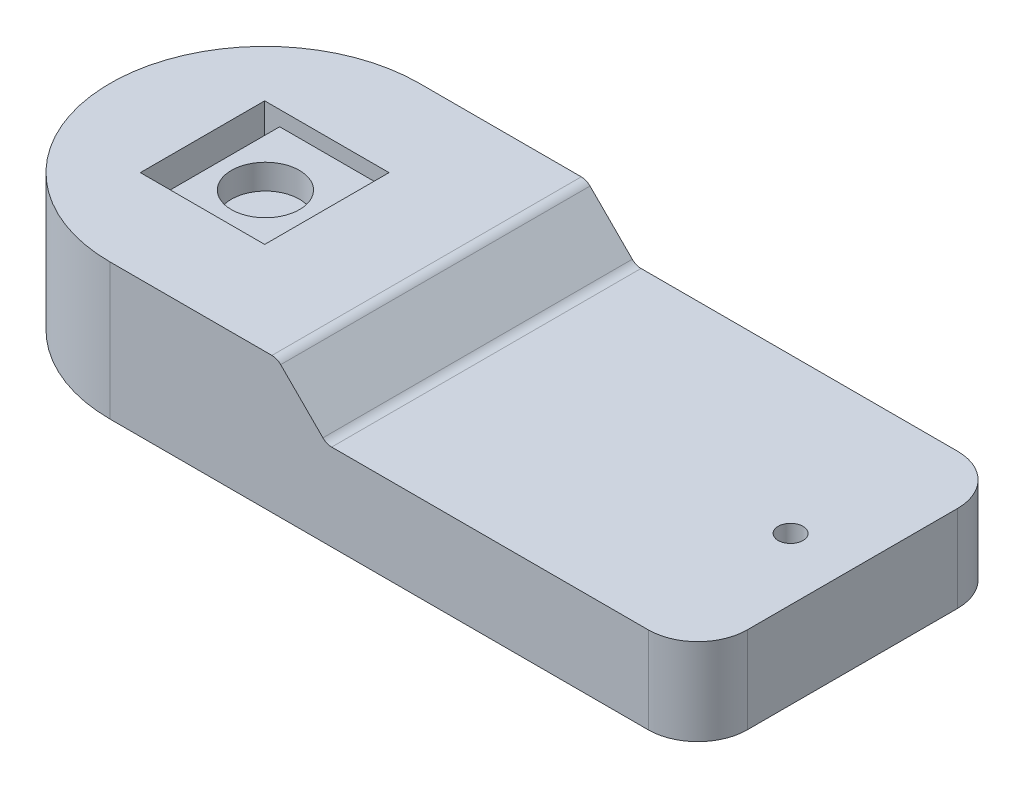
ISO-10303-21;
HEADER;
FILE_DESCRIPTION(('STEP AP214'),'2;1');
FILE_NAME('part.step','',(''),(''),'','','');
FILE_SCHEMA(('AUTOMOTIVE_DESIGN { 1 0 10303 214 1 1 1 1 }'));
ENDSEC;
DATA;
#1=APPLICATION_CONTEXT('core data for automotive mechanical design processes');
#2=APPLICATION_PROTOCOL_DEFINITION('international standard','automotive_design',2000,#1);
#3=PRODUCT_CONTEXT('',#1,'mechanical');
#4=PRODUCT('Part','Part','',(#3));
#5=PRODUCT_RELATED_PRODUCT_CATEGORY('part','',(#4));
#6=PRODUCT_DEFINITION_FORMATION('','',#4);
#7=PRODUCT_DEFINITION_CONTEXT('part definition',#1,'design');
#8=PRODUCT_DEFINITION('design','',#6,#7);
#9=PRODUCT_DEFINITION_SHAPE('','',#8);
#10=(LENGTH_UNIT() NAMED_UNIT(*) SI_UNIT(.MILLI.,.METRE.));
#11=(NAMED_UNIT(*) PLANE_ANGLE_UNIT() SI_UNIT($,.RADIAN.));
#12=(NAMED_UNIT(*) SI_UNIT($,.STERADIAN.) SOLID_ANGLE_UNIT());
#13=UNCERTAINTY_MEASURE_WITH_UNIT(LENGTH_MEASURE(1.E-05),#10,'distance_accuracy_value','');
#14=(GEOMETRIC_REPRESENTATION_CONTEXT(3) GLOBAL_UNCERTAINTY_ASSIGNED_CONTEXT((#13)) GLOBAL_UNIT_ASSIGNED_CONTEXT((#10,
#11,#12)) REPRESENTATION_CONTEXT('',''));
#15=CARTESIAN_POINT('',(0.,0.,0.));
#16=DIRECTION('',(0.,0.,1.));
#17=DIRECTION('',(1.,0.,0.));
#18=AXIS2_PLACEMENT_3D('',#15,#16,#17);
#19=CARTESIAN_POINT('',(-17.5,11.,0.));
#20=DIRECTION('',(0.,-1.,0.));
#21=DIRECTION('',(0.,0.,-1.));
#22=AXIS2_PLACEMENT_3D('',#19,#20,#21);
#23=CYLINDRICAL_SURFACE('',#22,12.5);
#24=DIRECTION('',(0.,-1.,0.));
#25=VECTOR('',#24,1.);
#26=CARTESIAN_POINT('',(-17.5,11.,12.5));
#27=LINE('',#26,#25);
#28=CARTESIAN_POINT('',(-17.5,11.,12.5));
#29=VERTEX_POINT('',#28);
#30=CARTESIAN_POINT('',(-17.5,0.,12.5));
#31=VERTEX_POINT('',#30);
#32=EDGE_CURVE('E252',#29,#31,#27,.T.);
#33=ORIENTED_EDGE('',*,*,#32,.F.);
#34=CARTESIAN_POINT('',(-17.5,11.,0.));
#35=DIRECTION('',(0.,1.,0.));
#36=DIRECTION('',(0.,0.,1.));
#37=AXIS2_PLACEMENT_3D('',#34,#35,#36);
#38=CIRCLE('',#37,12.5);
#39=CARTESIAN_POINT('',(-17.5,11.,-12.5));
#40=VERTEX_POINT('',#39);
#41=EDGE_CURVE('E262',#40,#29,#38,.T.);
#42=ORIENTED_EDGE('',*,*,#41,.F.);
#43=DIRECTION('',(0.,-1.,0.));
#44=VECTOR('',#43,1.);
#45=CARTESIAN_POINT('',(-17.5,11.,-12.5));
#46=LINE('',#45,#44);
#47=CARTESIAN_POINT('',(-17.5,0.,-12.5));
#48=VERTEX_POINT('',#47);
#49=EDGE_CURVE('E259',#48,#40,#46,.F.);
#50=ORIENTED_EDGE('',*,*,#49,.F.);
#51=CARTESIAN_POINT('',(-17.5,0.,0.));
#52=DIRECTION('',(0.,1.,0.));
#53=DIRECTION('',(0.,0.,1.));
#54=AXIS2_PLACEMENT_3D('',#51,#52,#53);
#55=CIRCLE('',#54,12.5);
#56=EDGE_CURVE('E264',#31,#48,#55,.F.);
#57=ORIENTED_EDGE('',*,*,#56,.F.);
#58=EDGE_LOOP('',(#33,#42,#50,#57));
#59=FACE_BOUND('',#58,.T.);
#60=ADVANCED_FACE('F34',(#59),#23,.T.);
#61=CARTESIAN_POINT('',(30.,11.,-12.5));
#62=DIRECTION('',(-1.,0.,0.));
#63=DIRECTION('',(0.,0.,1.));
#64=AXIS2_PLACEMENT_3D('',#61,#62,#63);
#65=PLANE('',#64);
#66=DIRECTION('',(0.,0.,-1.));
#67=VECTOR('',#66,1.);
#68=CARTESIAN_POINT('',(30.,0.,-12.5));
#69=LINE('',#68,#67);
#70=CARTESIAN_POINT('',(30.,0.,8.5));
#71=VERTEX_POINT('',#70);
#72=CARTESIAN_POINT('',(30.,0.,-8.5));
#73=VERTEX_POINT('',#72);
#74=EDGE_CURVE('E254',#71,#73,#69,.T.);
#75=ORIENTED_EDGE('',*,*,#74,.T.);
#76=DIRECTION('',(0.,-1.,0.));
#77=VECTOR('',#76,1.);
#78=CARTESIAN_POINT('',(30.,11.,-8.5));
#79=LINE('',#78,#77);
#80=CARTESIAN_POINT('',(30.,7.,-8.5));
#81=VERTEX_POINT('',#80);
#82=EDGE_CURVE('E55',#73,#81,#79,.F.);
#83=ORIENTED_EDGE('',*,*,#82,.T.);
#84=DIRECTION('',(0.,0.,-1.));
#85=VECTOR('',#84,1.);
#86=CARTESIAN_POINT('',(30.,7.,12.5));
#87=LINE('',#86,#85);
#88=CARTESIAN_POINT('',(30.,7.,8.5));
#89=VERTEX_POINT('',#88);
#90=EDGE_CURVE('E241',#89,#81,#87,.T.);
#91=ORIENTED_EDGE('',*,*,#90,.F.);
#92=DIRECTION('',(0.,-1.,0.));
#93=VECTOR('',#92,1.);
#94=CARTESIAN_POINT('',(30.,11.,8.5));
#95=LINE('',#94,#93);
#96=EDGE_CURVE('E299',#89,#71,#95,.T.);
#97=ORIENTED_EDGE('',*,*,#96,.T.);
#98=EDGE_LOOP('',(#75,#83,#91,#97));
#99=FACE_BOUND('',#98,.T.);
#100=ADVANCED_FACE('F319',(#99),#65,.F.);
#101=CARTESIAN_POINT('',(-30.,11.,12.5));
#102=DIRECTION('',(0.,0.,-1.));
#103=DIRECTION('',(-1.,0.,0.));
#104=AXIS2_PLACEMENT_3D('',#101,#102,#103);
#105=PLANE('',#104);
#106=DIRECTION('',(1.,0.,0.));
#107=VECTOR('',#106,1.);
#108=CARTESIAN_POINT('',(-30.,0.,12.5));
#109=LINE('',#108,#107);
#110=CARTESIAN_POINT('',(26.,0.,12.5));
#111=VERTEX_POINT('',#110);
#112=EDGE_CURVE('E245',#31,#111,#109,.T.);
#113=ORIENTED_EDGE('',*,*,#112,.T.);
#114=DIRECTION('',(0.,-1.,0.));
#115=VECTOR('',#114,1.);
#116=CARTESIAN_POINT('',(26.,11.,12.5));
#117=LINE('',#116,#115);
#118=CARTESIAN_POINT('',(26.,7.,12.5));
#119=VERTEX_POINT('',#118);
#120=EDGE_CURVE('E11',#111,#119,#117,.F.);
#121=ORIENTED_EDGE('',*,*,#120,.T.);
#122=DIRECTION('',(1.,0.,0.));
#123=VECTOR('',#122,1.);
#124=CARTESIAN_POINT('',(0.,7.,12.5));
#125=LINE('',#124,#123);
#126=CARTESIAN_POINT('',(0.41421356237307,7.,12.5));
#127=VERTEX_POINT('',#126);
#128=EDGE_CURVE('E233',#127,#119,#125,.T.);
#129=ORIENTED_EDGE('',*,*,#128,.F.);
#130=CARTESIAN_POINT('',(0.41421356237307,8.,12.5));
#131=DIRECTION('',(0.,0.,-1.));
#132=DIRECTION('',(-1.,0.,0.));
#133=AXIS2_PLACEMENT_3D('',#130,#131,#132);
#134=CIRCLE('',#133,1.);
#135=CARTESIAN_POINT('',(-0.292893218813478,7.29289321881345,12.5));
#136=VERTEX_POINT('',#135);
#137=EDGE_CURVE('E287',#127,#136,#134,.T.);
#138=ORIENTED_EDGE('',*,*,#137,.T.);
#139=DIRECTION('',(-0.707106781186548,0.707106781186548,0.));
#140=VECTOR('',#139,1.);
#141=CARTESIAN_POINT('',(0.,6.99999999999998,12.5));
#142=LINE('',#141,#140);
#143=CARTESIAN_POINT('',(-3.70710678118657,10.7071067811865,12.5));
#144=VERTEX_POINT('',#143);
#145=EDGE_CURVE('E267',#136,#144,#142,.T.);
#146=ORIENTED_EDGE('',*,*,#145,.T.);
#147=CARTESIAN_POINT('',(-4.41421356237312,10.,12.5));
#148=DIRECTION('',(0.,0.,-1.));
#149=DIRECTION('',(-1.,0.,0.));
#150=AXIS2_PLACEMENT_3D('',#147,#148,#149);
#151=CIRCLE('',#150,1.);
#152=CARTESIAN_POINT('',(-4.41421356237312,11.,12.5));
#153=VERTEX_POINT('',#152);
#154=EDGE_CURVE('E285',#144,#153,#151,.F.);
#155=ORIENTED_EDGE('',*,*,#154,.T.);
#156=DIRECTION('',(1.,0.,0.));
#157=VECTOR('',#156,1.);
#158=CARTESIAN_POINT('',(-30.,11.,12.5));
#159=LINE('',#158,#157);
#160=EDGE_CURVE('E246',#29,#153,#159,.T.);
#161=ORIENTED_EDGE('',*,*,#160,.F.);
#162=ORIENTED_EDGE('',*,*,#32,.T.);
#163=EDGE_LOOP('',(#113,#121,#129,#138,#146,#155,#161,#162));
#164=FACE_BOUND('',#163,.T.);
#165=ADVANCED_FACE('F324',(#164),#105,.F.);
#166=CARTESIAN_POINT('',(-30.,11.,-12.5));
#167=DIRECTION('',(0.,0.,1.));
#168=DIRECTION('',(1.,0.,0.));
#169=AXIS2_PLACEMENT_3D('',#166,#167,#168);
#170=PLANE('',#169);
#171=DIRECTION('',(-1.,0.,0.));
#172=VECTOR('',#171,1.);
#173=CARTESIAN_POINT('',(30.,7.,-12.5));
#174=LINE('',#173,#172);
#175=CARTESIAN_POINT('',(26.,7.,-12.5));
#176=VERTEX_POINT('',#175);
#177=CARTESIAN_POINT('',(0.414213562373061,7.,-12.5));
#178=VERTEX_POINT('',#177);
#179=EDGE_CURVE('E243',#176,#178,#174,.T.);
#180=ORIENTED_EDGE('',*,*,#179,.F.);
#181=DIRECTION('',(0.,-1.,0.));
#182=VECTOR('',#181,1.);
#183=CARTESIAN_POINT('',(26.,11.,-12.5));
#184=LINE('',#183,#182);
#185=CARTESIAN_POINT('',(26.,0.,-12.5));
#186=VERTEX_POINT('',#185);
#187=EDGE_CURVE('E292',#176,#186,#184,.T.);
#188=ORIENTED_EDGE('',*,*,#187,.T.);
#189=DIRECTION('',(-1.,0.,0.));
#190=VECTOR('',#189,1.);
#191=CARTESIAN_POINT('',(-30.,0.,-12.5));
#192=LINE('',#191,#190);
#193=EDGE_CURVE('E250',#186,#48,#192,.T.);
#194=ORIENTED_EDGE('',*,*,#193,.T.);
#195=ORIENTED_EDGE('',*,*,#49,.T.);
#196=DIRECTION('',(-1.,0.,0.));
#197=VECTOR('',#196,1.);
#198=CARTESIAN_POINT('',(-30.,11.,-12.5));
#199=LINE('',#198,#197);
#200=CARTESIAN_POINT('',(-4.41421356237313,11.,-12.5));
#201=VERTEX_POINT('',#200);
#202=EDGE_CURVE('E249',#201,#40,#199,.T.);
#203=ORIENTED_EDGE('',*,*,#202,.F.);
#204=CARTESIAN_POINT('',(-4.41421356237313,10.,-12.5));
#205=DIRECTION('',(0.,0.,1.));
#206=DIRECTION('',(1.,0.,0.));
#207=AXIS2_PLACEMENT_3D('',#204,#205,#206);
#208=CIRCLE('',#207,1.);
#209=CARTESIAN_POINT('',(-3.70710678118658,10.7071067811865,-12.5));
#210=VERTEX_POINT('',#209);
#211=EDGE_CURVE('E283',#201,#210,#208,.F.);
#212=ORIENTED_EDGE('',*,*,#211,.T.);
#213=DIRECTION('',(0.707106781186548,-0.707106781186548,0.));
#214=VECTOR('',#213,1.);
#215=CARTESIAN_POINT('',(0.,6.99999999999998,-12.5));
#216=LINE('',#215,#214);
#217=CARTESIAN_POINT('',(-0.292893218813485,7.29289321881345,-12.5));
#218=VERTEX_POINT('',#217);
#219=EDGE_CURVE('E270',#210,#218,#216,.T.);
#220=ORIENTED_EDGE('',*,*,#219,.T.);
#221=CARTESIAN_POINT('',(0.414213562373063,8.,-12.5));
#222=DIRECTION('',(0.,0.,1.));
#223=DIRECTION('',(1.,0.,0.));
#224=AXIS2_PLACEMENT_3D('',#221,#222,#223);
#225=CIRCLE('',#224,1.);
#226=EDGE_CURVE('E289',#218,#178,#225,.T.);
#227=ORIENTED_EDGE('',*,*,#226,.T.);
#228=EDGE_LOOP('',(#180,#188,#194,#195,#203,#212,#220,#227));
#229=FACE_BOUND('',#228,.T.);
#230=ADVANCED_FACE('F311',(#229),#170,.F.);
#231=CARTESIAN_POINT('',(0.,11.,0.));
#232=DIRECTION('',(0.,1.,0.));
#233=DIRECTION('',(0.,0.,1.));
#234=AXIS2_PLACEMENT_3D('',#231,#232,#233);
#235=PLANE('',#234);
#236=DIRECTION('',(0.,0.,1.));
#237=VECTOR('',#236,1.);
#238=CARTESIAN_POINT('',(-22.525,11.,-5.025));
#239=LINE('',#238,#237);
#240=CARTESIAN_POINT('',(-22.525,11.,-5.025));
#241=VERTEX_POINT('',#240);
#242=CARTESIAN_POINT('',(-22.525,11.,5.025));
#243=VERTEX_POINT('',#242);
#244=EDGE_CURVE('E196',#241,#243,#239,.T.);
#245=ORIENTED_EDGE('',*,*,#244,.F.);
#246=DIRECTION('',(-1.,0.,0.));
#247=VECTOR('',#246,1.);
#248=CARTESIAN_POINT('',(-22.525,11.,-5.025));
#249=LINE('',#248,#247);
#250=CARTESIAN_POINT('',(-12.475,11.,-5.025));
#251=VERTEX_POINT('',#250);
#252=EDGE_CURVE('E220',#251,#241,#249,.T.);
#253=ORIENTED_EDGE('',*,*,#252,.F.);
#254=DIRECTION('',(0.,0.,-1.));
#255=VECTOR('',#254,1.);
#256=CARTESIAN_POINT('',(-12.475,11.,-5.025));
#257=LINE('',#256,#255);
#258=CARTESIAN_POINT('',(-12.475,11.,5.025));
#259=VERTEX_POINT('',#258);
#260=EDGE_CURVE('E227',#259,#251,#257,.T.);
#261=ORIENTED_EDGE('',*,*,#260,.F.);
#262=DIRECTION('',(1.,0.,0.));
#263=VECTOR('',#262,1.);
#264=CARTESIAN_POINT('',(-22.525,11.,5.025));
#265=LINE('',#264,#263);
#266=EDGE_CURVE('E224',#243,#259,#265,.T.);
#267=ORIENTED_EDGE('',*,*,#266,.F.);
#268=EDGE_LOOP('',(#245,#253,#261,#267));
#269=FACE_BOUND('',#268,.T.);
#270=ORIENTED_EDGE('',*,*,#160,.T.);
#271=DIRECTION('',(0.,0.,-1.));
#272=VECTOR('',#271,1.);
#273=CARTESIAN_POINT('',(-4.41421356237312,11.,0.));
#274=LINE('',#273,#272);
#275=EDGE_CURVE('E280',#153,#201,#274,.T.);
#276=ORIENTED_EDGE('',*,*,#275,.T.);
#277=ORIENTED_EDGE('',*,*,#202,.T.);
#278=ORIENTED_EDGE('',*,*,#41,.T.);
#279=EDGE_LOOP('',(#270,#276,#277,#278));
#280=FACE_BOUND('',#279,.T.);
#281=ADVANCED_FACE('F333',(#269,#280),#235,.T.);
#282=CARTESIAN_POINT('',(0.,0.,0.));
#283=DIRECTION('',(0.,1.,0.));
#284=DIRECTION('',(0.,0.,1.));
#285=AXIS2_PLACEMENT_3D('',#282,#283,#284);
#286=PLANE('',#285);
#287=CARTESIAN_POINT('',(25.,0.,0.));
#288=DIRECTION('',(0.,1.,0.));
#289=DIRECTION('',(0.,0.,1.));
#290=AXIS2_PLACEMENT_3D('',#287,#288,#289);
#291=CIRCLE('',#290,1.);
#292=CARTESIAN_POINT('',(25.,0.,1.));
#293=VERTEX_POINT('',#292);
#294=EDGE_CURVE('E438',#293,#293,#291,.T.);
#295=ORIENTED_EDGE('',*,*,#294,.T.);
#296=EDGE_LOOP('',(#295));
#297=FACE_BOUND('',#296,.T.);
#298=CARTESIAN_POINT('',(-17.5,0.,0.));
#299=DIRECTION('',(0.,-1.,0.));
#300=DIRECTION('',(0.,0.,-1.));
#301=AXIS2_PLACEMENT_3D('',#298,#299,#300);
#302=CIRCLE('',#301,6.96);
#303=CARTESIAN_POINT('',(-17.5,0.,-6.96));
#304=VERTEX_POINT('',#303);
#305=EDGE_CURVE('E449',#304,#304,#302,.T.);
#306=ORIENTED_EDGE('',*,*,#305,.F.);
#307=EDGE_LOOP('',(#306));
#308=FACE_BOUND('',#307,.T.);
#309=ORIENTED_EDGE('',*,*,#193,.F.);
#310=CARTESIAN_POINT('',(26.,0.,-8.5));
#311=DIRECTION('',(0.,1.,0.));
#312=DIRECTION('',(0.,0.,1.));
#313=AXIS2_PLACEMENT_3D('',#310,#311,#312);
#314=CIRCLE('',#313,4.);
#315=EDGE_CURVE('E297',#186,#73,#314,.F.);
#316=ORIENTED_EDGE('',*,*,#315,.T.);
#317=ORIENTED_EDGE('',*,*,#74,.F.);
#318=CARTESIAN_POINT('',(26.,0.,8.5));
#319=DIRECTION('',(0.,1.,0.));
#320=DIRECTION('',(0.,0.,1.));
#321=AXIS2_PLACEMENT_3D('',#318,#319,#320);
#322=CIRCLE('',#321,4.);
#323=EDGE_CURVE('E295',#71,#111,#322,.F.);
#324=ORIENTED_EDGE('',*,*,#323,.T.);
#325=ORIENTED_EDGE('',*,*,#112,.F.);
#326=ORIENTED_EDGE('',*,*,#56,.T.);
#327=EDGE_LOOP('',(#309,#316,#317,#324,#325,#326));
#328=FACE_BOUND('',#327,.T.);
#329=ADVANCED_FACE('F318',(#297,#308,#328),#286,.F.);
#330=CARTESIAN_POINT('',(0.,7.,0.));
#331=DIRECTION('',(0.,1.,0.));
#332=DIRECTION('',(0.,0.,1.));
#333=AXIS2_PLACEMENT_3D('',#330,#331,#332);
#334=PLANE('',#333);
#335=CARTESIAN_POINT('',(25.,7.,0.));
#336=DIRECTION('',(0.,1.,0.));
#337=DIRECTION('',(0.,0.,1.));
#338=AXIS2_PLACEMENT_3D('',#335,#336,#337);
#339=CIRCLE('',#338,1.);
#340=CARTESIAN_POINT('',(25.,7.,1.));
#341=VERTEX_POINT('',#340);
#342=EDGE_CURVE('E441',#341,#341,#339,.T.);
#343=ORIENTED_EDGE('',*,*,#342,.F.);
#344=EDGE_LOOP('',(#343));
#345=FACE_BOUND('',#344,.T.);
#346=ORIENTED_EDGE('',*,*,#90,.T.);
#347=CARTESIAN_POINT('',(26.,7.,-8.5));
#348=DIRECTION('',(0.,1.,0.));
#349=DIRECTION('',(0.,0.,1.));
#350=AXIS2_PLACEMENT_3D('',#347,#348,#349);
#351=CIRCLE('',#350,4.);
#352=EDGE_CURVE('E42',#81,#176,#351,.T.);
#353=ORIENTED_EDGE('',*,*,#352,.T.);
#354=ORIENTED_EDGE('',*,*,#179,.T.);
#355=DIRECTION('',(0.,0.,1.));
#356=VECTOR('',#355,1.);
#357=CARTESIAN_POINT('',(0.41421356237307,7.,12.5));
#358=LINE('',#357,#356);
#359=EDGE_CURVE('E273',#178,#127,#358,.T.);
#360=ORIENTED_EDGE('',*,*,#359,.T.);
#361=ORIENTED_EDGE('',*,*,#128,.T.);
#362=CARTESIAN_POINT('',(26.,7.,8.5));
#363=DIRECTION('',(0.,1.,0.));
#364=DIRECTION('',(0.,0.,1.));
#365=AXIS2_PLACEMENT_3D('',#362,#363,#364);
#366=CIRCLE('',#365,4.);
#367=EDGE_CURVE('E303',#119,#89,#366,.T.);
#368=ORIENTED_EDGE('',*,*,#367,.T.);
#369=EDGE_LOOP('',(#346,#353,#354,#360,#361,#368));
#370=FACE_BOUND('',#369,.T.);
#371=ADVANCED_FACE('F307',(#345,#370),#334,.T.);
#372=CARTESIAN_POINT('',(-22.525,9.79,-5.025));
#373=DIRECTION('',(-1.,0.,0.));
#374=DIRECTION('',(0.,0.,1.));
#375=AXIS2_PLACEMENT_3D('',#372,#373,#374);
#376=PLANE('',#375);
#377=ORIENTED_EDGE('',*,*,#244,.T.);
#378=DIRECTION('',(0.,1.,0.));
#379=VECTOR('',#378,1.);
#380=CARTESIAN_POINT('',(-22.525,9.79,5.025));
#381=LINE('',#380,#379);
#382=CARTESIAN_POINT('',(-22.525,7.77,5.025));
#383=VERTEX_POINT('',#382);
#384=EDGE_CURVE('E222',#383,#243,#381,.T.);
#385=ORIENTED_EDGE('',*,*,#384,.F.);
#386=DIRECTION('',(0.,0.,1.));
#387=VECTOR('',#386,1.);
#388=CARTESIAN_POINT('',(-22.525,7.77,5.025));
#389=LINE('',#388,#387);
#390=CARTESIAN_POINT('',(-22.525,7.77,-5.025));
#391=VERTEX_POINT('',#390);
#392=EDGE_CURVE('E198',#391,#383,#389,.T.);
#393=ORIENTED_EDGE('',*,*,#392,.F.);
#394=DIRECTION('',(0.,1.,0.));
#395=VECTOR('',#394,1.);
#396=CARTESIAN_POINT('',(-22.525,9.79,-5.025));
#397=LINE('',#396,#395);
#398=EDGE_CURVE('E231',#391,#241,#397,.T.);
#399=ORIENTED_EDGE('',*,*,#398,.T.);
#400=EDGE_LOOP('',(#377,#385,#393,#399));
#401=FACE_BOUND('',#400,.T.);
#402=ADVANCED_FACE('F376',(#401),#376,.F.);
#403=CARTESIAN_POINT('',(-22.525,9.79,-5.025));
#404=DIRECTION('',(0.,0.,-1.));
#405=DIRECTION('',(-1.,0.,0.));
#406=AXIS2_PLACEMENT_3D('',#403,#404,#405);
#407=PLANE('',#406);
#408=ORIENTED_EDGE('',*,*,#252,.T.);
#409=ORIENTED_EDGE('',*,*,#398,.F.);
#410=DIRECTION('',(-1.,0.,0.));
#411=VECTOR('',#410,1.);
#412=CARTESIAN_POINT('',(-22.525,7.77,-5.025));
#413=LINE('',#412,#411);
#414=CARTESIAN_POINT('',(-21.315,7.77,-5.025));
#415=VERTEX_POINT('',#414);
#416=EDGE_CURVE('E208',#415,#391,#413,.T.);
#417=ORIENTED_EDGE('',*,*,#416,.F.);
#418=DIRECTION('',(0.,1.,0.));
#419=VECTOR('',#418,1.);
#420=CARTESIAN_POINT('',(-21.315,7.77,-5.025));
#421=LINE('',#420,#419);
#422=CARTESIAN_POINT('',(-21.315,9.79,-5.025));
#423=VERTEX_POINT('',#422);
#424=EDGE_CURVE('E188',#415,#423,#421,.T.);
#425=ORIENTED_EDGE('',*,*,#424,.T.);
#426=DIRECTION('',(-1.,0.,0.));
#427=VECTOR('',#426,1.);
#428=CARTESIAN_POINT('',(-22.525,9.79,-5.025));
#429=LINE('',#428,#427);
#430=CARTESIAN_POINT('',(-13.685,9.79,-5.025));
#431=VERTEX_POINT('',#430);
#432=EDGE_CURVE('E169',#431,#423,#429,.T.);
#433=ORIENTED_EDGE('',*,*,#432,.F.);
#434=DIRECTION('',(0.,1.,0.));
#435=VECTOR('',#434,1.);
#436=CARTESIAN_POINT('',(-13.685,7.77,-5.025));
#437=LINE('',#436,#435);
#438=CARTESIAN_POINT('',(-13.685,7.77,-5.025));
#439=VERTEX_POINT('',#438);
#440=EDGE_CURVE('E161',#439,#431,#437,.T.);
#441=ORIENTED_EDGE('',*,*,#440,.F.);
#442=DIRECTION('',(-1.,0.,0.));
#443=VECTOR('',#442,1.);
#444=CARTESIAN_POINT('',(-12.475,7.77,-5.025));
#445=LINE('',#444,#443);
#446=CARTESIAN_POINT('',(-12.475,7.77,-5.025));
#447=VERTEX_POINT('',#446);
#448=EDGE_CURVE('E166',#447,#439,#445,.T.);
#449=ORIENTED_EDGE('',*,*,#448,.F.);
#450=DIRECTION('',(0.,1.,0.));
#451=VECTOR('',#450,1.);
#452=CARTESIAN_POINT('',(-12.475,9.79,-5.025));
#453=LINE('',#452,#451);
#454=EDGE_CURVE('E234',#447,#251,#453,.T.);
#455=ORIENTED_EDGE('',*,*,#454,.T.);
#456=EDGE_LOOP('',(#408,#409,#417,#425,#433,#441,#449,#455));
#457=FACE_BOUND('',#456,.T.);
#458=ADVANCED_FACE('F164',(#457),#407,.F.);
#459=CARTESIAN_POINT('',(-12.475,9.79,-5.025));
#460=DIRECTION('',(1.,0.,0.));
#461=DIRECTION('',(0.,0.,-1.));
#462=AXIS2_PLACEMENT_3D('',#459,#460,#461);
#463=PLANE('',#462);
#464=ORIENTED_EDGE('',*,*,#260,.T.);
#465=ORIENTED_EDGE('',*,*,#454,.F.);
#466=DIRECTION('',(0.,0.,-1.));
#467=VECTOR('',#466,1.);
#468=CARTESIAN_POINT('',(-12.475,7.77,5.025));
#469=LINE('',#468,#467);
#470=CARTESIAN_POINT('',(-12.475,7.77,5.025));
#471=VERTEX_POINT('',#470);
#472=EDGE_CURVE('E174',#471,#447,#469,.T.);
#473=ORIENTED_EDGE('',*,*,#472,.F.);
#474=DIRECTION('',(0.,1.,0.));
#475=VECTOR('',#474,1.);
#476=CARTESIAN_POINT('',(-12.475,9.79,5.025));
#477=LINE('',#476,#475);
#478=EDGE_CURVE('E236',#471,#259,#477,.T.);
#479=ORIENTED_EDGE('',*,*,#478,.T.);
#480=EDGE_LOOP('',(#464,#465,#473,#479));
#481=FACE_BOUND('',#480,.T.);
#482=ADVANCED_FACE('F385',(#481),#463,.F.);
#483=CARTESIAN_POINT('',(-22.525,9.79,5.025));
#484=DIRECTION('',(0.,0.,1.));
#485=DIRECTION('',(1.,0.,0.));
#486=AXIS2_PLACEMENT_3D('',#483,#484,#485);
#487=PLANE('',#486);
#488=ORIENTED_EDGE('',*,*,#266,.T.);
#489=ORIENTED_EDGE('',*,*,#478,.F.);
#490=DIRECTION('',(1.,0.,0.));
#491=VECTOR('',#490,1.);
#492=CARTESIAN_POINT('',(-13.685,7.77,5.025));
#493=LINE('',#492,#491);
#494=CARTESIAN_POINT('',(-13.685,7.77,5.025));
#495=VERTEX_POINT('',#494);
#496=EDGE_CURVE('E182',#495,#471,#493,.T.);
#497=ORIENTED_EDGE('',*,*,#496,.F.);
#498=DIRECTION('',(0.,1.,0.));
#499=VECTOR('',#498,1.);
#500=CARTESIAN_POINT('',(-13.685,7.77,5.025));
#501=LINE('',#500,#499);
#502=CARTESIAN_POINT('',(-13.685,9.79,5.025));
#503=VERTEX_POINT('',#502);
#504=EDGE_CURVE('E173',#495,#503,#501,.T.);
#505=ORIENTED_EDGE('',*,*,#504,.T.);
#506=DIRECTION('',(1.,0.,0.));
#507=VECTOR('',#506,1.);
#508=CARTESIAN_POINT('',(-22.525,9.79,5.025));
#509=LINE('',#508,#507);
#510=CARTESIAN_POINT('',(-21.315,9.79,5.025));
#511=VERTEX_POINT('',#510);
#512=EDGE_CURVE('E217',#511,#503,#509,.T.);
#513=ORIENTED_EDGE('',*,*,#512,.F.);
#514=DIRECTION('',(0.,1.,0.));
#515=VECTOR('',#514,1.);
#516=CARTESIAN_POINT('',(-21.315,7.77,5.025));
#517=LINE('',#516,#515);
#518=CARTESIAN_POINT('',(-21.315,7.77,5.025));
#519=VERTEX_POINT('',#518);
#520=EDGE_CURVE('E211',#519,#511,#517,.T.);
#521=ORIENTED_EDGE('',*,*,#520,.F.);
#522=DIRECTION('',(1.,0.,0.));
#523=VECTOR('',#522,1.);
#524=CARTESIAN_POINT('',(-21.315,7.77,5.025));
#525=LINE('',#524,#523);
#526=EDGE_CURVE('E201',#383,#519,#525,.T.);
#527=ORIENTED_EDGE('',*,*,#526,.F.);
#528=ORIENTED_EDGE('',*,*,#384,.T.);
#529=EDGE_LOOP('',(#488,#489,#497,#505,#513,#521,#527,#528));
#530=FACE_BOUND('',#529,.T.);
#531=ADVANCED_FACE('F381',(#530),#487,.F.);
#532=CARTESIAN_POINT('',(0.,9.79,0.));
#533=DIRECTION('',(0.,1.,0.));
#534=DIRECTION('',(0.,0.,1.));
#535=AXIS2_PLACEMENT_3D('',#532,#533,#534);
#536=PLANE('',#535);
#537=CARTESIAN_POINT('',(-17.465,9.79,-0.0250000000000007));
#538=DIRECTION('',(0.,1.,0.));
#539=DIRECTION('',(0.,0.,1.));
#540=AXIS2_PLACEMENT_3D('',#537,#538,#539);
#541=CIRCLE('',#540,2.75);
#542=CARTESIAN_POINT('',(-17.465,9.79,2.725));
#543=VERTEX_POINT('',#542);
#544=EDGE_CURVE('E191',#543,#543,#541,.T.);
#545=ORIENTED_EDGE('',*,*,#544,.F.);
#546=EDGE_LOOP('',(#545));
#547=FACE_BOUND('',#546,.T.);
#548=DIRECTION('',(0.,0.,1.));
#549=VECTOR('',#548,1.);
#550=CARTESIAN_POINT('',(-13.685,9.79,-5.025));
#551=LINE('',#550,#549);
#552=EDGE_CURVE('E186',#431,#503,#551,.T.);
#553=ORIENTED_EDGE('',*,*,#552,.F.);
#554=ORIENTED_EDGE('',*,*,#432,.T.);
#555=DIRECTION('',(0.,0.,-1.));
#556=VECTOR('',#555,1.);
#557=CARTESIAN_POINT('',(-21.315,9.79,-5.025));
#558=LINE('',#557,#556);
#559=EDGE_CURVE('E202',#511,#423,#558,.T.);
#560=ORIENTED_EDGE('',*,*,#559,.F.);
#561=ORIENTED_EDGE('',*,*,#512,.T.);
#562=EDGE_LOOP('',(#553,#554,#560,#561));
#563=FACE_BOUND('',#562,.T.);
#564=ADVANCED_FACE('F384',(#547,#563),#536,.T.);
#565=CARTESIAN_POINT('',(-21.315,7.77,-5.025));
#566=DIRECTION('',(1.,0.,0.));
#567=DIRECTION('',(0.,0.,-1.));
#568=AXIS2_PLACEMENT_3D('',#565,#566,#567);
#569=PLANE('',#568);
#570=ORIENTED_EDGE('',*,*,#559,.T.);
#571=ORIENTED_EDGE('',*,*,#424,.F.);
#572=DIRECTION('',(0.,0.,-1.));
#573=VECTOR('',#572,1.);
#574=CARTESIAN_POINT('',(-21.315,7.77,-5.025));
#575=LINE('',#574,#573);
#576=EDGE_CURVE('E205',#519,#415,#575,.T.);
#577=ORIENTED_EDGE('',*,*,#576,.F.);
#578=ORIENTED_EDGE('',*,*,#520,.T.);
#579=EDGE_LOOP('',(#570,#571,#577,#578));
#580=FACE_BOUND('',#579,.T.);
#581=ADVANCED_FACE('F394',(#580),#569,.F.);
#582=CARTESIAN_POINT('',(0.,7.77,0.));
#583=DIRECTION('',(0.,-1.,0.));
#584=DIRECTION('',(0.,0.,-1.));
#585=AXIS2_PLACEMENT_3D('',#582,#583,#584);
#586=PLANE('',#585);
#587=ORIENTED_EDGE('',*,*,#392,.T.);
#588=ORIENTED_EDGE('',*,*,#526,.T.);
#589=ORIENTED_EDGE('',*,*,#576,.T.);
#590=ORIENTED_EDGE('',*,*,#416,.T.);
#591=EDGE_LOOP('',(#587,#588,#589,#590));
#592=FACE_BOUND('',#591,.T.);
#593=ADVANCED_FACE('F398',(#592),#586,.F.);
#594=CARTESIAN_POINT('',(-13.685,7.77,-5.025));
#595=DIRECTION('',(-1.,0.,0.));
#596=DIRECTION('',(0.,0.,1.));
#597=AXIS2_PLACEMENT_3D('',#594,#595,#596);
#598=PLANE('',#597);
#599=ORIENTED_EDGE('',*,*,#552,.T.);
#600=ORIENTED_EDGE('',*,*,#504,.F.);
#601=DIRECTION('',(0.,0.,1.));
#602=VECTOR('',#601,1.);
#603=CARTESIAN_POINT('',(-13.685,7.77,-5.025));
#604=LINE('',#603,#602);
#605=EDGE_CURVE('E177',#439,#495,#604,.T.);
#606=ORIENTED_EDGE('',*,*,#605,.F.);
#607=ORIENTED_EDGE('',*,*,#440,.T.);
#608=EDGE_LOOP('',(#599,#600,#606,#607));
#609=FACE_BOUND('',#608,.T.);
#610=ADVANCED_FACE('F178',(#609),#598,.F.);
#611=CARTESIAN_POINT('',(0.,7.77,0.));
#612=DIRECTION('',(0.,1.,0.));
#613=DIRECTION('',(0.,0.,1.));
#614=AXIS2_PLACEMENT_3D('',#611,#612,#613);
#615=PLANE('',#614);
#616=ORIENTED_EDGE('',*,*,#448,.T.);
#617=ORIENTED_EDGE('',*,*,#605,.T.);
#618=ORIENTED_EDGE('',*,*,#496,.T.);
#619=ORIENTED_EDGE('',*,*,#472,.T.);
#620=EDGE_LOOP('',(#616,#617,#618,#619));
#621=FACE_BOUND('',#620,.T.);
#622=ADVANCED_FACE('F184',(#621),#615,.T.);
#623=CARTESIAN_POINT('',(-17.465,7.77,-0.0250000000000007));
#624=DIRECTION('',(0.,1.,0.));
#625=DIRECTION('',(0.,0.,1.));
#626=AXIS2_PLACEMENT_3D('',#623,#624,#625);
#627=CYLINDRICAL_SURFACE('',#626,2.75);
#628=CARTESIAN_POINT('',(-17.465,7.77,-0.0250000000000007));
#629=DIRECTION('',(0.,1.,0.));
#630=DIRECTION('',(0.,0.,1.));
#631=AXIS2_PLACEMENT_3D('',#628,#629,#630);
#632=CIRCLE('',#631,2.75);
#633=CARTESIAN_POINT('',(-17.465,7.77,2.725));
#634=VERTEX_POINT('',#633);
#635=EDGE_CURVE('E214',#634,#634,#632,.T.);
#636=ORIENTED_EDGE('',*,*,#635,.F.);
#637=EDGE_LOOP('',(#636));
#638=FACE_BOUND('',#637,.T.);
#639=ORIENTED_EDGE('',*,*,#544,.T.);
#640=EDGE_LOOP('',(#639));
#641=FACE_BOUND('',#640,.T.);
#642=ADVANCED_FACE('F407',(#638,#641),#627,.F.);
#643=CARTESIAN_POINT('',(-17.465,7.77,-0.0250000000000007));
#644=DIRECTION('',(0.,1.,0.));
#645=DIRECTION('',(0.,0.,1.));
#646=AXIS2_PLACEMENT_3D('',#643,#644,#645);
#647=PLANE('',#646);
#648=ORIENTED_EDGE('',*,*,#635,.T.);
#649=EDGE_LOOP('',(#648));
#650=FACE_BOUND('',#649,.T.);
#651=ADVANCED_FACE('F352',(#650),#647,.T.);
#652=CARTESIAN_POINT('',(0.,6.99999999999998,-12.5));
#653=DIRECTION('',(0.707106781186548,0.707106781186548,0.));
#654=DIRECTION('',(0.,0.,-1.));
#655=AXIS2_PLACEMENT_3D('',#652,#653,#654);
#656=PLANE('',#655);
#657=ORIENTED_EDGE('',*,*,#145,.F.);
#658=DIRECTION('',(0.,0.,1.));
#659=VECTOR('',#658,1.);
#660=CARTESIAN_POINT('',(-0.292893218813485,7.29289321881345,-12.5));
#661=LINE('',#660,#659);
#662=EDGE_CURVE('E278',#136,#218,#661,.F.);
#663=ORIENTED_EDGE('',*,*,#662,.T.);
#664=ORIENTED_EDGE('',*,*,#219,.F.);
#665=DIRECTION('',(0.,0.,-1.));
#666=VECTOR('',#665,1.);
#667=CARTESIAN_POINT('',(-3.70710678118658,10.7071067811865,-12.5));
#668=LINE('',#667,#666);
#669=EDGE_CURVE('E276',#210,#144,#668,.F.);
#670=ORIENTED_EDGE('',*,*,#669,.T.);
#671=EDGE_LOOP('',(#657,#663,#664,#670));
#672=FACE_BOUND('',#671,.T.);
#673=ADVANCED_FACE('F341',(#672),#656,.T.);
#674=CARTESIAN_POINT('',(0.414213562373067,8.,0.));
#675=DIRECTION('',(0.,0.,-1.));
#676=DIRECTION('',(-1.,0.,0.));
#677=AXIS2_PLACEMENT_3D('',#674,#675,#676);
#678=CYLINDRICAL_SURFACE('',#677,1.);
#679=ORIENTED_EDGE('',*,*,#226,.F.);
#680=ORIENTED_EDGE('',*,*,#662,.F.);
#681=ORIENTED_EDGE('',*,*,#137,.F.);
#682=ORIENTED_EDGE('',*,*,#359,.F.);
#683=EDGE_LOOP('',(#679,#680,#681,#682));
#684=FACE_BOUND('',#683,.T.);
#685=ADVANCED_FACE('F344',(#684),#678,.F.);
#686=CARTESIAN_POINT('',(-4.41421356237312,10.,0.));
#687=DIRECTION('',(0.,0.,-1.));
#688=DIRECTION('',(-1.,0.,0.));
#689=AXIS2_PLACEMENT_3D('',#686,#687,#688);
#690=CYLINDRICAL_SURFACE('',#689,1.);
#691=ORIENTED_EDGE('',*,*,#154,.F.);
#692=ORIENTED_EDGE('',*,*,#669,.F.);
#693=ORIENTED_EDGE('',*,*,#211,.F.);
#694=ORIENTED_EDGE('',*,*,#275,.F.);
#695=EDGE_LOOP('',(#691,#692,#693,#694));
#696=FACE_BOUND('',#695,.T.);
#697=ADVANCED_FACE('F337',(#696),#690,.T.);
#698=CARTESIAN_POINT('',(26.,11.,-8.5));
#699=DIRECTION('',(0.,-1.,0.));
#700=DIRECTION('',(0.,0.,-1.));
#701=AXIS2_PLACEMENT_3D('',#698,#699,#700);
#702=CYLINDRICAL_SURFACE('',#701,4.);
#703=ORIENTED_EDGE('',*,*,#352,.F.);
#704=ORIENTED_EDGE('',*,*,#82,.F.);
#705=ORIENTED_EDGE('',*,*,#315,.F.);
#706=ORIENTED_EDGE('',*,*,#187,.F.);
#707=EDGE_LOOP('',(#703,#704,#705,#706));
#708=FACE_BOUND('',#707,.T.);
#709=ADVANCED_FACE('F315',(#708),#702,.T.);
#710=CARTESIAN_POINT('',(26.,11.,8.5));
#711=DIRECTION('',(0.,-1.,0.));
#712=DIRECTION('',(0.,0.,-1.));
#713=AXIS2_PLACEMENT_3D('',#710,#711,#712);
#714=CYLINDRICAL_SURFACE('',#713,4.);
#715=ORIENTED_EDGE('',*,*,#367,.F.);
#716=ORIENTED_EDGE('',*,*,#120,.F.);
#717=ORIENTED_EDGE('',*,*,#323,.F.);
#718=ORIENTED_EDGE('',*,*,#96,.F.);
#719=EDGE_LOOP('',(#715,#716,#717,#718));
#720=FACE_BOUND('',#719,.T.);
#721=ADVANCED_FACE('F36',(#720),#714,.T.);
#722=CARTESIAN_POINT('',(-17.5,1.1,0.));
#723=DIRECTION('',(0.,-1.,0.));
#724=DIRECTION('',(0.,0.,-1.));
#725=AXIS2_PLACEMENT_3D('',#722,#723,#724);
#726=CYLINDRICAL_SURFACE('',#725,6.96);
#727=CARTESIAN_POINT('',(-17.5,1.1,0.));
#728=DIRECTION('',(0.,-1.,0.));
#729=DIRECTION('',(0.,0.,-1.));
#730=AXIS2_PLACEMENT_3D('',#727,#728,#729);
#731=CIRCLE('',#730,6.96);
#732=CARTESIAN_POINT('',(-17.5,1.1,-6.96));
#733=VERTEX_POINT('',#732);
#734=EDGE_CURVE('E452',#733,#733,#731,.T.);
#735=ORIENTED_EDGE('',*,*,#734,.F.);
#736=EDGE_LOOP('',(#735));
#737=FACE_BOUND('',#736,.T.);
#738=ORIENTED_EDGE('',*,*,#305,.T.);
#739=EDGE_LOOP('',(#738));
#740=FACE_BOUND('',#739,.T.);
#741=ADVANCED_FACE('F414',(#737,#740),#726,.F.);
#742=CARTESIAN_POINT('',(-17.5,1.1,0.));
#743=DIRECTION('',(0.,-1.,0.));
#744=DIRECTION('',(0.,0.,-1.));
#745=AXIS2_PLACEMENT_3D('',#742,#743,#744);
#746=PLANE('',#745);
#747=CARTESIAN_POINT('',(-17.5,1.1,0.));
#748=DIRECTION('',(0.,-1.,0.));
#749=DIRECTION('',(0.,0.,-1.));
#750=AXIS2_PLACEMENT_3D('',#747,#748,#749);
#751=CIRCLE('',#750,6.4);
#752=CARTESIAN_POINT('',(-17.5,1.1,-6.4));
#753=VERTEX_POINT('',#752);
#754=EDGE_CURVE('E443',#753,#753,#751,.T.);
#755=ORIENTED_EDGE('',*,*,#754,.F.);
#756=EDGE_LOOP('',(#755));
#757=FACE_BOUND('',#756,.T.);
#758=ORIENTED_EDGE('',*,*,#734,.T.);
#759=EDGE_LOOP('',(#758));
#760=FACE_BOUND('',#759,.T.);
#761=ADVANCED_FACE('F417',(#757,#760),#746,.T.);
#762=CARTESIAN_POINT('',(-17.5,4.7,0.));
#763=DIRECTION('',(0.,-1.,0.));
#764=DIRECTION('',(0.,0.,-1.));
#765=AXIS2_PLACEMENT_3D('',#762,#763,#764);
#766=CYLINDRICAL_SURFACE('',#765,6.4);
#767=CARTESIAN_POINT('',(-17.5,4.7,0.));
#768=DIRECTION('',(0.,-1.,0.));
#769=DIRECTION('',(0.,0.,-1.));
#770=AXIS2_PLACEMENT_3D('',#767,#768,#769);
#771=CIRCLE('',#770,6.4);
#772=CARTESIAN_POINT('',(-17.5,4.7,-6.4));
#773=VERTEX_POINT('',#772);
#774=EDGE_CURVE('E446',#773,#773,#771,.T.);
#775=ORIENTED_EDGE('',*,*,#774,.F.);
#776=EDGE_LOOP('',(#775));
#777=FACE_BOUND('',#776,.T.);
#778=ORIENTED_EDGE('',*,*,#754,.T.);
#779=EDGE_LOOP('',(#778));
#780=FACE_BOUND('',#779,.T.);
#781=ADVANCED_FACE('F421',(#777,#780),#766,.F.);
#782=CARTESIAN_POINT('',(-17.5,4.7,0.));
#783=DIRECTION('',(0.,-1.,0.));
#784=DIRECTION('',(0.,0.,-1.));
#785=AXIS2_PLACEMENT_3D('',#782,#783,#784);
#786=PLANE('',#785);
#787=ORIENTED_EDGE('',*,*,#774,.T.);
#788=EDGE_LOOP('',(#787));
#789=FACE_BOUND('',#788,.T.);
#790=ADVANCED_FACE('F425',(#789),#786,.T.);
#791=CARTESIAN_POINT('',(25.,0.,0.));
#792=DIRECTION('',(0.,1.,0.));
#793=DIRECTION('',(0.,0.,1.));
#794=AXIS2_PLACEMENT_3D('',#791,#792,#793);
#795=CYLINDRICAL_SURFACE('',#794,1.);
#796=CARTESIAN_POINT('',(25.,0.,1.));
#797=CARTESIAN_POINT('',(25.,0.0729166666666667,1.));
#798=CARTESIAN_POINT('',(25.,0.145833333333333,1.));
#799=CARTESIAN_POINT('',(25.,0.291666666666667,1.));
#800=CARTESIAN_POINT('',(25.,0.364583333333333,1.));
#801=CARTESIAN_POINT('',(25.,0.510416666666667,1.));
#802=CARTESIAN_POINT('',(25.,0.583333333333333,1.));
#803=CARTESIAN_POINT('',(25.,0.729166666666667,1.));
#804=CARTESIAN_POINT('',(25.,0.802083333333333,1.));
#805=CARTESIAN_POINT('',(25.,0.947916666666666,1.));
#806=CARTESIAN_POINT('',(25.,1.02083333333333,1.));
#807=CARTESIAN_POINT('',(25.,1.16666666666667,1.));
#808=CARTESIAN_POINT('',(25.,1.23958333333333,1.));
#809=CARTESIAN_POINT('',(25.,1.38541666666667,1.));
#810=CARTESIAN_POINT('',(25.,1.45833333333333,1.));
#811=CARTESIAN_POINT('',(25.,1.60416666666667,1.));
#812=CARTESIAN_POINT('',(25.,1.67708333333333,1.));
#813=CARTESIAN_POINT('',(25.,1.82291666666667,1.));
#814=CARTESIAN_POINT('',(25.,1.89583333333333,1.));
#815=CARTESIAN_POINT('',(25.,2.04166666666667,1.));
#816=CARTESIAN_POINT('',(25.,2.11458333333333,1.));
#817=CARTESIAN_POINT('',(25.,2.26041666666667,1.));
#818=CARTESIAN_POINT('',(25.,2.33333333333333,1.));
#819=CARTESIAN_POINT('',(25.,2.47916666666667,1.));
#820=CARTESIAN_POINT('',(25.,2.55208333333333,1.));
#821=CARTESIAN_POINT('',(25.,2.69791666666667,1.));
#822=CARTESIAN_POINT('',(25.,2.77083333333333,1.));
#823=CARTESIAN_POINT('',(25.,2.91666666666667,1.));
#824=CARTESIAN_POINT('',(25.,2.98958333333333,1.));
#825=CARTESIAN_POINT('',(25.,3.13541666666667,1.));
#826=CARTESIAN_POINT('',(25.,3.20833333333333,1.));
#827=CARTESIAN_POINT('',(25.,3.35416666666667,1.));
#828=CARTESIAN_POINT('',(25.,3.42708333333333,1.));
#829=CARTESIAN_POINT('',(25.,3.57291666666667,1.));
#830=CARTESIAN_POINT('',(25.,3.64583333333333,1.));
#831=CARTESIAN_POINT('',(25.,3.79166666666667,1.));
#832=CARTESIAN_POINT('',(25.,3.86458333333333,1.));
#833=CARTESIAN_POINT('',(25.,4.01041666666667,1.));
#834=CARTESIAN_POINT('',(25.,4.08333333333333,1.));
#835=CARTESIAN_POINT('',(25.,4.22916666666667,1.));
#836=CARTESIAN_POINT('',(25.,4.30208333333333,1.));
#837=CARTESIAN_POINT('',(25.,4.44791666666667,1.));
#838=CARTESIAN_POINT('',(25.,4.52083333333333,1.));
#839=CARTESIAN_POINT('',(25.,4.66666666666667,1.));
#840=CARTESIAN_POINT('',(25.,4.73958333333333,1.));
#841=CARTESIAN_POINT('',(25.,4.88541666666666,1.));
#842=CARTESIAN_POINT('',(25.,4.95833333333333,1.));
#843=CARTESIAN_POINT('',(25.,5.10416666666667,1.));
#844=CARTESIAN_POINT('',(25.,5.17708333333333,1.));
#845=CARTESIAN_POINT('',(25.,5.32291666666667,1.));
#846=CARTESIAN_POINT('',(25.,5.39583333333333,1.));
#847=CARTESIAN_POINT('',(25.,5.54166666666667,1.));
#848=CARTESIAN_POINT('',(25.,5.61458333333333,1.));
#849=CARTESIAN_POINT('',(25.,5.76041666666667,1.));
#850=CARTESIAN_POINT('',(25.,5.83333333333333,1.));
#851=CARTESIAN_POINT('',(25.,5.97916666666667,1.));
#852=CARTESIAN_POINT('',(25.,6.05208333333333,1.));
#853=CARTESIAN_POINT('',(25.,6.19791666666667,1.));
#854=CARTESIAN_POINT('',(25.,6.27083333333333,1.));
#855=CARTESIAN_POINT('',(25.,6.41666666666667,1.));
#856=CARTESIAN_POINT('',(25.,6.48958333333333,1.));
#857=CARTESIAN_POINT('',(25.,6.63541666666666,1.));
#858=CARTESIAN_POINT('',(25.,6.70833333333333,1.));
#859=CARTESIAN_POINT('',(25.,6.85416666666666,1.));
#860=CARTESIAN_POINT('',(25.,6.92708333333333,1.));
#861=CARTESIAN_POINT('',(25.,7.,1.));
#862=B_SPLINE_CURVE_WITH_KNOTS('',3,(#796,#797,#798,#799,#800,#801,#802,#803,#804,#805,#806,
#807,#808,#809,#810,#811,#812,#813,#814,#815,#816,#817,#818,#819,#820,#821,#822,#823,#824,#825,
#826,#827,#828,#829,#830,#831,#832,#833,#834,#835,#836,#837,#838,#839,#840,#841,#842,#843,#844,
#845,#846,#847,#848,#849,#850,#851,#852,#853,#854,#855,#856,#857,#858,#859,#860,#861),
.UNSPECIFIED.,.F.,.F.,(4,2,2,2,2,2,2,2,2,2,2,2,2,2,2,2,2,2,2,2,2,2,2,2,2,2,2,2,2,2,2,2,4),(0.,
0.21875,0.4375,0.65625,0.875,1.09375,1.3125,1.53125,1.75,1.96875,2.1875,2.40625,2.625,2.84375,
3.0625,3.28125,3.5,3.71875,3.9375,4.15625,4.375,4.59375,4.8125,5.03125,5.25,5.46875,5.6875,
5.90625,6.125,6.34375,6.5625,6.78125,7.),.UNSPECIFIED.);
#863=EDGE_CURVE('BSEAM429',#293,#341,#862,.T.);
#864=ORIENTED_EDGE('',*,*,#294,.F.);
#865=ORIENTED_EDGE('',*,*,#342,.T.);
#866=ORIENTED_EDGE('',*,*,#863,.T.);
#867=ORIENTED_EDGE('',*,*,#863,.F.);
#868=EDGE_LOOP('',(#864,#866,#865,#867));
#869=FACE_BOUND('',#868,.T.);
#870=ADVANCED_FACE('F429',(#869),#795,.F.);
#871=CLOSED_SHELL('',(#60,#100,#165,#230,#281,#329,#371,#402,#458,#482,#531,#564,#581,#593,#610,
#622,#642,#651,#673,#685,#697,#709,#721,#741,#761,#781,#790,#870));
#872=MANIFOLD_SOLID_BREP('B2',#871);
#873=ADVANCED_BREP_SHAPE_REPRESENTATION('',(#18,#872),#14);
#874=SHAPE_DEFINITION_REPRESENTATION(#9,#873);
ENDSEC;
END-ISO-10303-21;
